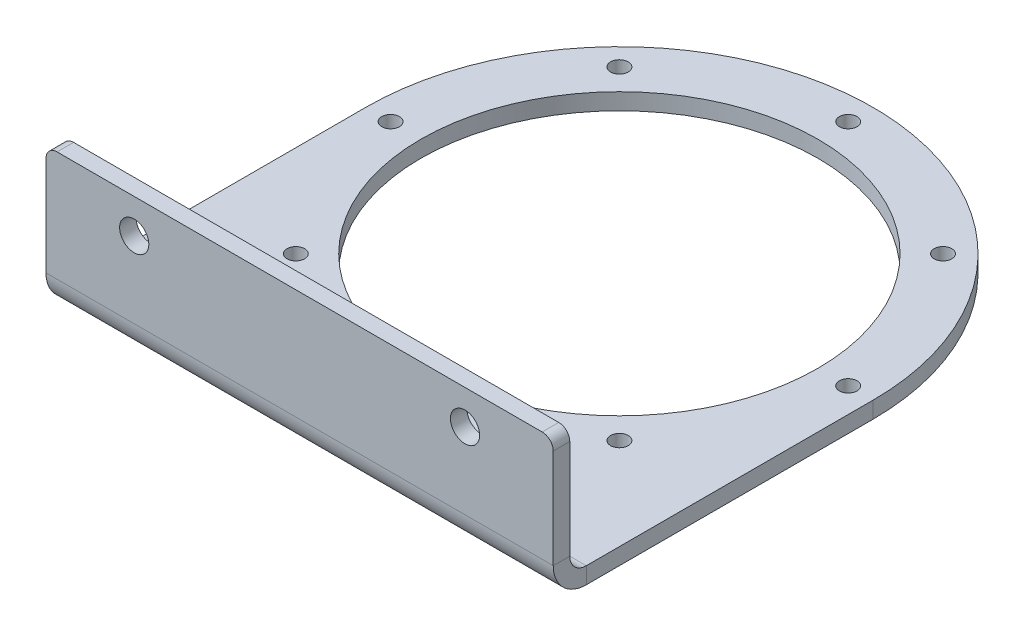
ISO-10303-21;
HEADER;
FILE_DESCRIPTION(('STEP AP214'),'2;1');
FILE_NAME('part.step','',(''),(''),'','','');
FILE_SCHEMA(('AUTOMOTIVE_DESIGN { 1 0 10303 214 1 1 1 1 }'));
ENDSEC;
DATA;
#1=APPLICATION_CONTEXT('core data for automotive mechanical design processes');
#2=APPLICATION_PROTOCOL_DEFINITION('international standard','automotive_design',2000,#1);
#3=PRODUCT_CONTEXT('',#1,'mechanical');
#4=PRODUCT('Part','Part','',(#3));
#5=PRODUCT_RELATED_PRODUCT_CATEGORY('part','',(#4));
#6=PRODUCT_DEFINITION_FORMATION('','',#4);
#7=PRODUCT_DEFINITION_CONTEXT('part definition',#1,'design');
#8=PRODUCT_DEFINITION('design','',#6,#7);
#9=PRODUCT_DEFINITION_SHAPE('','',#8);
#10=(LENGTH_UNIT() NAMED_UNIT(*) SI_UNIT(.MILLI.,.METRE.));
#11=(NAMED_UNIT(*) PLANE_ANGLE_UNIT() SI_UNIT($,.RADIAN.));
#12=(NAMED_UNIT(*) SI_UNIT($,.STERADIAN.) SOLID_ANGLE_UNIT());
#13=UNCERTAINTY_MEASURE_WITH_UNIT(LENGTH_MEASURE(1.E-05),#10,'distance_accuracy_value','');
#14=(GEOMETRIC_REPRESENTATION_CONTEXT(3) GLOBAL_UNCERTAINTY_ASSIGNED_CONTEXT((#13)) GLOBAL_UNIT_ASSIGNED_CONTEXT((#10,
#11,#12)) REPRESENTATION_CONTEXT('',''));
#15=CARTESIAN_POINT('',(0.,0.,0.));
#16=DIRECTION('',(0.,0.,1.));
#17=DIRECTION('',(1.,0.,0.));
#18=AXIS2_PLACEMENT_3D('',#15,#16,#17);
#19=CARTESIAN_POINT('',(46.,-3.,55.));
#20=DIRECTION('',(1.,0.,0.));
#21=DIRECTION('',(0.,0.,-1.));
#22=AXIS2_PLACEMENT_3D('',#19,#20,#21);
#23=PLANE('',#22);
#24=DIRECTION('',(0.,0.,-1.));
#25=VECTOR('',#24,1.);
#26=CARTESIAN_POINT('',(46.,0.,55.));
#27=LINE('',#26,#25);
#28=CARTESIAN_POINT('',(46.,0.,52.));
#29=VERTEX_POINT('',#28);
#30=CARTESIAN_POINT('',(46.,0.,0.));
#31=VERTEX_POINT('',#30);
#32=EDGE_CURVE('E220',#29,#31,#27,.T.);
#33=ORIENTED_EDGE('',*,*,#32,.F.);
#34=DIRECTION('',(0.,-1.,0.));
#35=VECTOR('',#34,1.);
#36=CARTESIAN_POINT('',(46.,0.,52.));
#37=LINE('',#36,#35);
#38=CARTESIAN_POINT('',(46.,-3.00000000000001,52.));
#39=VERTEX_POINT('',#38);
#40=EDGE_CURVE('E188',#29,#39,#37,.T.);
#41=ORIENTED_EDGE('',*,*,#40,.T.);
#42=DIRECTION('',(0.,0.,-1.));
#43=VECTOR('',#42,1.);
#44=CARTESIAN_POINT('',(46.,-3.,55.));
#45=LINE('',#44,#43);
#46=CARTESIAN_POINT('',(46.,-3.,0.));
#47=VERTEX_POINT('',#46);
#48=EDGE_CURVE('E224',#39,#47,#45,.T.);
#49=ORIENTED_EDGE('',*,*,#48,.T.);
#50=DIRECTION('',(0.,1.,0.));
#51=VECTOR('',#50,1.);
#52=CARTESIAN_POINT('',(46.,-3.,0.));
#53=LINE('',#52,#51);
#54=EDGE_CURVE('E237',#47,#31,#53,.T.);
#55=ORIENTED_EDGE('',*,*,#54,.T.);
#56=EDGE_LOOP('',(#33,#41,#49,#55));
#57=FACE_BOUND('',#56,.T.);
#58=ADVANCED_FACE('F49',(#57),#23,.T.);
#59=CARTESIAN_POINT('',(0.,-3.,0.));
#60=DIRECTION('',(0.,1.,0.));
#61=DIRECTION('',(0.,0.,1.));
#62=AXIS2_PLACEMENT_3D('',#59,#60,#61);
#63=PLANE('',#62);
#64=CARTESIAN_POINT('',(0.,-3.,-41.5));
#65=DIRECTION('',(0.,1.,0.));
#66=DIRECTION('',(0.,0.,1.));
#67=AXIS2_PLACEMENT_3D('',#64,#65,#66);
#68=CIRCLE('',#67,1.59999999999998);
#69=CARTESIAN_POINT('',(0.,-3.,-39.9));
#70=VERTEX_POINT('',#69);
#71=EDGE_CURVE('E274',#70,#70,#68,.T.);
#72=ORIENTED_EDGE('',*,*,#71,.T.);
#73=EDGE_LOOP('',(#72));
#74=FACE_BOUND('',#73,.T.);
#75=CARTESIAN_POINT('',(29.3449314192417,-3.,-29.3449314192417));
#76=DIRECTION('',(0.,1.,0.));
#77=DIRECTION('',(0.,0.,1.));
#78=AXIS2_PLACEMENT_3D('',#75,#76,#77);
#79=CIRCLE('',#78,1.59999999999997);
#80=CARTESIAN_POINT('',(29.3449314192417,-3.,-27.7449314192418));
#81=VERTEX_POINT('',#80);
#82=EDGE_CURVE('E293',#81,#81,#79,.T.);
#83=ORIENTED_EDGE('',*,*,#82,.T.);
#84=EDGE_LOOP('',(#83));
#85=FACE_BOUND('',#84,.T.);
#86=CARTESIAN_POINT('',(41.5,-3.,0.));
#87=DIRECTION('',(0.,1.,0.));
#88=DIRECTION('',(0.,0.,1.));
#89=AXIS2_PLACEMENT_3D('',#86,#87,#88);
#90=CIRCLE('',#89,1.59999999999998);
#91=CARTESIAN_POINT('',(41.5,-3.,1.59999999999997));
#92=VERTEX_POINT('',#91);
#93=EDGE_CURVE('E301',#92,#92,#90,.T.);
#94=ORIENTED_EDGE('',*,*,#93,.T.);
#95=EDGE_LOOP('',(#94));
#96=FACE_BOUND('',#95,.T.);
#97=CARTESIAN_POINT('',(29.3449314192417,-3.,29.3449314192417));
#98=DIRECTION('',(0.,1.,0.));
#99=DIRECTION('',(0.,0.,1.));
#100=AXIS2_PLACEMENT_3D('',#97,#98,#99);
#101=CIRCLE('',#100,1.59999999999997);
#102=CARTESIAN_POINT('',(29.3449314192417,-3.,30.9449314192417));
#103=VERTEX_POINT('',#102);
#104=EDGE_CURVE('E309',#103,#103,#101,.T.);
#105=ORIENTED_EDGE('',*,*,#104,.T.);
#106=EDGE_LOOP('',(#105));
#107=FACE_BOUND('',#106,.T.);
#108=CARTESIAN_POINT('',(0.,-3.,41.5));
#109=DIRECTION('',(0.,1.,0.));
#110=DIRECTION('',(0.,0.,1.));
#111=AXIS2_PLACEMENT_3D('',#108,#109,#110);
#112=CIRCLE('',#111,1.59999999999998);
#113=CARTESIAN_POINT('',(0.,-3.,43.1));
#114=VERTEX_POINT('',#113);
#115=EDGE_CURVE('E317',#114,#114,#112,.T.);
#116=ORIENTED_EDGE('',*,*,#115,.T.);
#117=EDGE_LOOP('',(#116));
#118=FACE_BOUND('',#117,.T.);
#119=CARTESIAN_POINT('',(-29.3449314192417,-3.,29.3449314192417));
#120=DIRECTION('',(0.,1.,0.));
#121=DIRECTION('',(0.,0.,1.));
#122=AXIS2_PLACEMENT_3D('',#119,#120,#121);
#123=CIRCLE('',#122,1.59999999999997);
#124=CARTESIAN_POINT('',(-29.3449314192417,-3.,30.9449314192417));
#125=VERTEX_POINT('',#124);
#126=EDGE_CURVE('E325',#125,#125,#123,.T.);
#127=ORIENTED_EDGE('',*,*,#126,.T.);
#128=EDGE_LOOP('',(#127));
#129=FACE_BOUND('',#128,.T.);
#130=CARTESIAN_POINT('',(-41.5,-3.,0.));
#131=DIRECTION('',(0.,1.,0.));
#132=DIRECTION('',(0.,0.,1.));
#133=AXIS2_PLACEMENT_3D('',#130,#131,#132);
#134=CIRCLE('',#133,1.59999999999998);
#135=CARTESIAN_POINT('',(-41.5,-3.,1.59999999999998));
#136=VERTEX_POINT('',#135);
#137=EDGE_CURVE('E333',#136,#136,#134,.T.);
#138=ORIENTED_EDGE('',*,*,#137,.T.);
#139=EDGE_LOOP('',(#138));
#140=FACE_BOUND('',#139,.T.);
#141=CARTESIAN_POINT('',(-29.3449314192417,-3.,-29.3449314192417));
#142=DIRECTION('',(0.,1.,0.));
#143=DIRECTION('',(0.,0.,1.));
#144=AXIS2_PLACEMENT_3D('',#141,#142,#143);
#145=CIRCLE('',#144,1.59999999999997);
#146=CARTESIAN_POINT('',(-29.3449314192417,-3.,-27.7449314192418));
#147=VERTEX_POINT('',#146);
#148=EDGE_CURVE('E341',#147,#147,#145,.T.);
#149=ORIENTED_EDGE('',*,*,#148,.T.);
#150=EDGE_LOOP('',(#149));
#151=FACE_BOUND('',#150,.T.);
#152=CARTESIAN_POINT('',(0.,-3.,0.));
#153=DIRECTION('',(0.,1.,0.));
#154=DIRECTION('',(0.,0.,1.));
#155=AXIS2_PLACEMENT_3D('',#152,#153,#154);
#156=CIRCLE('',#155,36.);
#157=CARTESIAN_POINT('',(0.,-3.,36.));
#158=VERTEX_POINT('',#157);
#159=EDGE_CURVE('E207',#158,#158,#156,.T.);
#160=ORIENTED_EDGE('',*,*,#159,.T.);
#161=EDGE_LOOP('',(#160));
#162=FACE_BOUND('',#161,.T.);
#163=DIRECTION('',(1.,0.,0.));
#164=VECTOR('',#163,1.);
#165=CARTESIAN_POINT('',(46.,-3.00000000000001,52.));
#166=LINE('',#165,#164);
#167=CARTESIAN_POINT('',(-46.,-3.,52.));
#168=VERTEX_POINT('',#167);
#169=EDGE_CURVE('E139',#39,#168,#166,.F.);
#170=ORIENTED_EDGE('',*,*,#169,.T.);
#171=DIRECTION('',(0.,0.,1.));
#172=VECTOR('',#171,1.);
#173=CARTESIAN_POINT('',(-46.,-3.,0.));
#174=LINE('',#173,#172);
#175=CARTESIAN_POINT('',(-46.,-3.,0.));
#176=VERTEX_POINT('',#175);
#177=EDGE_CURVE('E219',#176,#168,#174,.T.);
#178=ORIENTED_EDGE('',*,*,#177,.F.);
#179=CARTESIAN_POINT('',(0.,-3.,0.));
#180=DIRECTION('',(0.,1.,0.));
#181=DIRECTION('',(0.,0.,1.));
#182=AXIS2_PLACEMENT_3D('',#179,#180,#181);
#183=CIRCLE('',#182,46.);
#184=EDGE_CURVE('E215',#47,#176,#183,.T.);
#185=ORIENTED_EDGE('',*,*,#184,.F.);
#186=ORIENTED_EDGE('',*,*,#48,.F.);
#187=EDGE_LOOP('',(#170,#178,#185,#186));
#188=FACE_BOUND('',#187,.T.);
#189=ADVANCED_FACE('F379',(#74,#85,#96,#107,#118,#129,#140,#151,#162,#188),#63,.F.);
#190=CARTESIAN_POINT('',(0.,0.,0.));
#191=DIRECTION('',(0.,1.,0.));
#192=DIRECTION('',(0.,0.,1.));
#193=AXIS2_PLACEMENT_3D('',#190,#191,#192);
#194=PLANE('',#193);
#195=CARTESIAN_POINT('',(0.,0.,-41.5));
#196=DIRECTION('',(0.,1.,0.));
#197=DIRECTION('',(0.,0.,1.));
#198=AXIS2_PLACEMENT_3D('',#195,#196,#197);
#199=CIRCLE('',#198,1.59999999999998);
#200=CARTESIAN_POINT('',(0.,0.,-39.9));
#201=VERTEX_POINT('',#200);
#202=EDGE_CURVE('E266',#201,#201,#199,.T.);
#203=ORIENTED_EDGE('',*,*,#202,.F.);
#204=EDGE_LOOP('',(#203));
#205=FACE_BOUND('',#204,.T.);
#206=CARTESIAN_POINT('',(29.3449314192417,0.,-29.3449314192417));
#207=DIRECTION('',(0.,1.,0.));
#208=DIRECTION('',(0.,0.,1.));
#209=AXIS2_PLACEMENT_3D('',#206,#207,#208);
#210=CIRCLE('',#209,1.59999999999998);
#211=CARTESIAN_POINT('',(29.3449314192417,0.,-27.7449314192417));
#212=VERTEX_POINT('',#211);
#213=EDGE_CURVE('E289',#212,#212,#210,.T.);
#214=ORIENTED_EDGE('',*,*,#213,.F.);
#215=EDGE_LOOP('',(#214));
#216=FACE_BOUND('',#215,.T.);
#217=CARTESIAN_POINT('',(41.5,0.,0.));
#218=DIRECTION('',(0.,1.,0.));
#219=DIRECTION('',(0.,0.,1.));
#220=AXIS2_PLACEMENT_3D('',#217,#218,#219);
#221=CIRCLE('',#220,1.59999999999998);
#222=CARTESIAN_POINT('',(41.5,0.,1.59999999999998));
#223=VERTEX_POINT('',#222);
#224=EDGE_CURVE('E297',#223,#223,#221,.T.);
#225=ORIENTED_EDGE('',*,*,#224,.F.);
#226=EDGE_LOOP('',(#225));
#227=FACE_BOUND('',#226,.T.);
#228=CARTESIAN_POINT('',(29.3449314192417,0.,29.3449314192417));
#229=DIRECTION('',(0.,1.,0.));
#230=DIRECTION('',(0.,0.,1.));
#231=AXIS2_PLACEMENT_3D('',#228,#229,#230);
#232=CIRCLE('',#231,1.59999999999998);
#233=CARTESIAN_POINT('',(29.3449314192417,0.,30.9449314192417));
#234=VERTEX_POINT('',#233);
#235=EDGE_CURVE('E305',#234,#234,#232,.T.);
#236=ORIENTED_EDGE('',*,*,#235,.F.);
#237=EDGE_LOOP('',(#236));
#238=FACE_BOUND('',#237,.T.);
#239=CARTESIAN_POINT('',(0.,0.,41.5));
#240=DIRECTION('',(0.,1.,0.));
#241=DIRECTION('',(0.,0.,1.));
#242=AXIS2_PLACEMENT_3D('',#239,#240,#241);
#243=CIRCLE('',#242,1.59999999999998);
#244=CARTESIAN_POINT('',(0.,0.,43.1));
#245=VERTEX_POINT('',#244);
#246=EDGE_CURVE('E313',#245,#245,#243,.T.);
#247=ORIENTED_EDGE('',*,*,#246,.F.);
#248=EDGE_LOOP('',(#247));
#249=FACE_BOUND('',#248,.T.);
#250=CARTESIAN_POINT('',(-29.3449314192417,0.,29.3449314192417));
#251=DIRECTION('',(0.,1.,0.));
#252=DIRECTION('',(0.,0.,1.));
#253=AXIS2_PLACEMENT_3D('',#250,#251,#252);
#254=CIRCLE('',#253,1.59999999999998);
#255=CARTESIAN_POINT('',(-29.3449314192417,0.,30.9449314192417));
#256=VERTEX_POINT('',#255);
#257=EDGE_CURVE('E321',#256,#256,#254,.T.);
#258=ORIENTED_EDGE('',*,*,#257,.F.);
#259=EDGE_LOOP('',(#258));
#260=FACE_BOUND('',#259,.T.);
#261=CARTESIAN_POINT('',(-41.5,0.,0.));
#262=DIRECTION('',(0.,1.,0.));
#263=DIRECTION('',(0.,0.,1.));
#264=AXIS2_PLACEMENT_3D('',#261,#262,#263);
#265=CIRCLE('',#264,1.59999999999998);
#266=CARTESIAN_POINT('',(-41.5,0.,1.59999999999999));
#267=VERTEX_POINT('',#266);
#268=EDGE_CURVE('E329',#267,#267,#265,.T.);
#269=ORIENTED_EDGE('',*,*,#268,.F.);
#270=EDGE_LOOP('',(#269));
#271=FACE_BOUND('',#270,.T.);
#272=CARTESIAN_POINT('',(-29.3449314192417,0.,-29.3449314192417));
#273=DIRECTION('',(0.,1.,0.));
#274=DIRECTION('',(0.,0.,1.));
#275=AXIS2_PLACEMENT_3D('',#272,#273,#274);
#276=CIRCLE('',#275,1.59999999999998);
#277=CARTESIAN_POINT('',(-29.3449314192417,0.,-27.7449314192417));
#278=VERTEX_POINT('',#277);
#279=EDGE_CURVE('E337',#278,#278,#276,.T.);
#280=ORIENTED_EDGE('',*,*,#279,.F.);
#281=EDGE_LOOP('',(#280));
#282=FACE_BOUND('',#281,.T.);
#283=CARTESIAN_POINT('',(0.,0.,0.));
#284=DIRECTION('',(0.,1.,0.));
#285=DIRECTION('',(0.,0.,1.));
#286=AXIS2_PLACEMENT_3D('',#283,#284,#285);
#287=CIRCLE('',#286,36.);
#288=CARTESIAN_POINT('',(0.,0.,36.));
#289=VERTEX_POINT('',#288);
#290=EDGE_CURVE('E203',#289,#289,#287,.T.);
#291=ORIENTED_EDGE('',*,*,#290,.F.);
#292=EDGE_LOOP('',(#291));
#293=FACE_BOUND('',#292,.T.);
#294=DIRECTION('',(0.,0.,1.));
#295=VECTOR('',#294,1.);
#296=CARTESIAN_POINT('',(-46.,0.,0.));
#297=LINE('',#296,#295);
#298=CARTESIAN_POINT('',(-46.,0.,0.));
#299=VERTEX_POINT('',#298);
#300=CARTESIAN_POINT('',(-46.,0.,52.));
#301=VERTEX_POINT('',#300);
#302=EDGE_CURVE('E231',#299,#301,#297,.T.);
#303=ORIENTED_EDGE('',*,*,#302,.T.);
#304=DIRECTION('',(1.,0.,0.));
#305=VECTOR('',#304,1.);
#306=CARTESIAN_POINT('',(46.,0.,52.));
#307=LINE('',#306,#305);
#308=EDGE_CURVE('E193',#29,#301,#307,.F.);
#309=ORIENTED_EDGE('',*,*,#308,.F.);
#310=ORIENTED_EDGE('',*,*,#32,.T.);
#311=CARTESIAN_POINT('',(0.,0.,0.));
#312=DIRECTION('',(0.,1.,0.));
#313=DIRECTION('',(0.,0.,1.));
#314=AXIS2_PLACEMENT_3D('',#311,#312,#313);
#315=CIRCLE('',#314,46.);
#316=EDGE_CURVE('E211',#31,#299,#315,.T.);
#317=ORIENTED_EDGE('',*,*,#316,.T.);
#318=EDGE_LOOP('',(#303,#309,#310,#317));
#319=FACE_BOUND('',#318,.T.);
#320=ADVANCED_FACE('F387',(#205,#216,#227,#238,#249,#260,#271,#282,#293,#319),#194,.T.);
#321=CARTESIAN_POINT('',(0.,-3.,0.));
#322=DIRECTION('',(0.,1.,0.));
#323=DIRECTION('',(0.,0.,1.));
#324=AXIS2_PLACEMENT_3D('',#321,#322,#323);
#325=CYLINDRICAL_SURFACE('',#324,46.);
#326=ORIENTED_EDGE('',*,*,#316,.F.);
#327=ORIENTED_EDGE('',*,*,#54,.F.);
#328=ORIENTED_EDGE('',*,*,#184,.T.);
#329=DIRECTION('',(0.,1.,0.));
#330=VECTOR('',#329,1.);
#331=CARTESIAN_POINT('',(-46.,-3.,0.));
#332=LINE('',#331,#330);
#333=EDGE_CURVE('E227',#176,#299,#332,.T.);
#334=ORIENTED_EDGE('',*,*,#333,.T.);
#335=EDGE_LOOP('',(#326,#327,#328,#334));
#336=FACE_BOUND('',#335,.T.);
#337=ADVANCED_FACE('F395',(#336),#325,.T.);
#338=CARTESIAN_POINT('',(-46.,-3.,0.));
#339=DIRECTION('',(-1.,0.,0.));
#340=DIRECTION('',(0.,0.,1.));
#341=AXIS2_PLACEMENT_3D('',#338,#339,#340);
#342=PLANE('',#341);
#343=DIRECTION('',(0.,-1.,0.));
#344=VECTOR('',#343,1.);
#345=CARTESIAN_POINT('',(-46.,0.,52.));
#346=LINE('',#345,#344);
#347=EDGE_CURVE('E199',#301,#168,#346,.T.);
#348=ORIENTED_EDGE('',*,*,#347,.F.);
#349=ORIENTED_EDGE('',*,*,#302,.F.);
#350=ORIENTED_EDGE('',*,*,#333,.F.);
#351=ORIENTED_EDGE('',*,*,#177,.T.);
#352=EDGE_LOOP('',(#348,#349,#350,#351));
#353=FACE_BOUND('',#352,.T.);
#354=ADVANCED_FACE('F393',(#353),#342,.T.);
#355=CARTESIAN_POINT('',(0.,-3.,0.));
#356=DIRECTION('',(0.,1.,0.));
#357=DIRECTION('',(0.,0.,1.));
#358=AXIS2_PLACEMENT_3D('',#355,#356,#357);
#359=CYLINDRICAL_SURFACE('',#358,36.);
#360=ORIENTED_EDGE('',*,*,#159,.F.);
#361=EDGE_LOOP('',(#360));
#362=FACE_BOUND('',#361,.T.);
#363=ORIENTED_EDGE('',*,*,#290,.T.);
#364=EDGE_LOOP('',(#363));
#365=FACE_BOUND('',#364,.T.);
#366=ADVANCED_FACE('F394',(#362,#365),#359,.F.);
#367=CARTESIAN_POINT('',(-46.,2.99999999999999,52.));
#368=DIRECTION('',(-1.,0.,0.));
#369=DIRECTION('',(0.,0.,1.));
#370=AXIS2_PLACEMENT_3D('',#367,#368,#369);
#371=PLANE('',#370);
#372=DIRECTION('',(0.,0.,1.));
#373=VECTOR('',#372,1.);
#374=CARTESIAN_POINT('',(-46.,2.99999999999999,55.));
#375=LINE('',#374,#373);
#376=CARTESIAN_POINT('',(-46.,2.99999999999999,55.));
#377=VERTEX_POINT('',#376);
#378=CARTESIAN_POINT('',(-46.,2.99999999999999,58.));
#379=VERTEX_POINT('',#378);
#380=EDGE_CURVE('E174',#377,#379,#375,.T.);
#381=ORIENTED_EDGE('',*,*,#380,.F.);
#382=CARTESIAN_POINT('',(-46.,2.99999999999999,52.));
#383=DIRECTION('',(1.,0.,0.));
#384=DIRECTION('',(0.,0.,-1.));
#385=AXIS2_PLACEMENT_3D('',#382,#383,#384);
#386=CIRCLE('',#385,3.);
#387=EDGE_CURVE('E143',#301,#377,#386,.F.);
#388=ORIENTED_EDGE('',*,*,#387,.F.);
#389=ORIENTED_EDGE('',*,*,#347,.T.);
#390=CARTESIAN_POINT('',(-46.,2.99999999999999,52.));
#391=DIRECTION('',(1.,0.,0.));
#392=DIRECTION('',(0.,0.,-1.));
#393=AXIS2_PLACEMENT_3D('',#390,#391,#392);
#394=CIRCLE('',#393,6.);
#395=EDGE_CURVE('E186',#168,#379,#394,.F.);
#396=ORIENTED_EDGE('',*,*,#395,.T.);
#397=EDGE_LOOP('',(#381,#388,#389,#396));
#398=FACE_BOUND('',#397,.T.);
#399=ADVANCED_FACE('F359',(#398),#371,.T.);
#400=CARTESIAN_POINT('',(46.,2.99999999999999,52.));
#401=DIRECTION('',(-1.,0.,0.));
#402=DIRECTION('',(0.,0.,1.));
#403=AXIS2_PLACEMENT_3D('',#400,#401,#402);
#404=PLANE('',#403);
#405=CARTESIAN_POINT('',(46.,2.99999999999999,52.));
#406=DIRECTION('',(1.,0.,0.));
#407=DIRECTION('',(0.,0.,-1.));
#408=AXIS2_PLACEMENT_3D('',#405,#406,#407);
#409=CIRCLE('',#408,3.);
#410=CARTESIAN_POINT('',(46.,2.99999999999999,55.));
#411=VERTEX_POINT('',#410);
#412=EDGE_CURVE('E150',#411,#29,#409,.T.);
#413=ORIENTED_EDGE('',*,*,#412,.F.);
#414=DIRECTION('',(0.,0.,1.));
#415=VECTOR('',#414,1.);
#416=CARTESIAN_POINT('',(46.,2.99999999999999,55.));
#417=LINE('',#416,#415);
#418=CARTESIAN_POINT('',(46.,2.99999999999999,58.));
#419=VERTEX_POINT('',#418);
#420=EDGE_CURVE('E147',#411,#419,#417,.T.);
#421=ORIENTED_EDGE('',*,*,#420,.T.);
#422=CARTESIAN_POINT('',(46.,2.99999999999999,52.));
#423=DIRECTION('',(1.,0.,0.));
#424=DIRECTION('',(0.,0.,-1.));
#425=AXIS2_PLACEMENT_3D('',#422,#423,#424);
#426=CIRCLE('',#425,6.);
#427=EDGE_CURVE('E132',#419,#39,#426,.T.);
#428=ORIENTED_EDGE('',*,*,#427,.T.);
#429=ORIENTED_EDGE('',*,*,#40,.F.);
#430=EDGE_LOOP('',(#413,#421,#428,#429));
#431=FACE_BOUND('',#430,.T.);
#432=ADVANCED_FACE('F148',(#431),#404,.F.);
#433=CARTESIAN_POINT('',(46.,2.99999999999999,52.));
#434=DIRECTION('',(1.,0.,0.));
#435=DIRECTION('',(0.,0.,1.));
#436=AXIS2_PLACEMENT_3D('',#433,#434,#435);
#437=CYLINDRICAL_SURFACE('',#436,6.);
#438=ORIENTED_EDGE('',*,*,#169,.F.);
#439=ORIENTED_EDGE('',*,*,#427,.F.);
#440=DIRECTION('',(-1.,0.,0.));
#441=VECTOR('',#440,1.);
#442=CARTESIAN_POINT('',(0.,2.99999999999999,58.));
#443=LINE('',#442,#441);
#444=EDGE_CURVE('E137',#419,#379,#443,.T.);
#445=ORIENTED_EDGE('',*,*,#444,.T.);
#446=ORIENTED_EDGE('',*,*,#395,.F.);
#447=EDGE_LOOP('',(#438,#439,#445,#446));
#448=FACE_BOUND('',#447,.T.);
#449=ADVANCED_FACE('F134',(#448),#437,.T.);
#450=CARTESIAN_POINT('',(46.,2.99999999999999,52.));
#451=DIRECTION('',(1.,0.,0.));
#452=DIRECTION('',(0.,0.,1.));
#453=AXIS2_PLACEMENT_3D('',#450,#451,#452);
#454=CYLINDRICAL_SURFACE('',#453,3.);
#455=ORIENTED_EDGE('',*,*,#308,.T.);
#456=ORIENTED_EDGE('',*,*,#387,.T.);
#457=DIRECTION('',(1.,0.,0.));
#458=VECTOR('',#457,1.);
#459=CARTESIAN_POINT('',(-46.,2.99999999999999,55.));
#460=LINE('',#459,#458);
#461=EDGE_CURVE('E153',#377,#411,#460,.T.);
#462=ORIENTED_EDGE('',*,*,#461,.T.);
#463=ORIENTED_EDGE('',*,*,#412,.T.);
#464=EDGE_LOOP('',(#455,#456,#462,#463));
#465=FACE_BOUND('',#464,.T.);
#466=ADVANCED_FACE('F360',(#465),#454,.F.);
#467=CARTESIAN_POINT('',(0.,0.,58.));
#468=DIRECTION('',(0.,0.,-1.));
#469=DIRECTION('',(-1.,0.,0.));
#470=AXIS2_PLACEMENT_3D('',#467,#468,#469);
#471=PLANE('',#470);
#472=CARTESIAN_POINT('',(30.,16.8,58.));
#473=DIRECTION('',(0.,0.,1.));
#474=DIRECTION('',(1.,0.,0.));
#475=AXIS2_PLACEMENT_3D('',#472,#473,#474);
#476=CIRCLE('',#475,2.64999999999999);
#477=CARTESIAN_POINT('',(32.65,16.8,58.));
#478=VERTEX_POINT('',#477);
#479=EDGE_CURVE('E283',#478,#478,#476,.T.);
#480=ORIENTED_EDGE('',*,*,#479,.F.);
#481=EDGE_LOOP('',(#480));
#482=FACE_BOUND('',#481,.T.);
#483=CARTESIAN_POINT('',(-30.,16.8,58.));
#484=DIRECTION('',(0.,0.,1.));
#485=DIRECTION('',(1.,0.,0.));
#486=AXIS2_PLACEMENT_3D('',#483,#484,#485);
#487=CIRCLE('',#486,2.64999999999999);
#488=CARTESIAN_POINT('',(-27.35,16.8,58.));
#489=VERTEX_POINT('',#488);
#490=EDGE_CURVE('E267',#489,#489,#487,.T.);
#491=ORIENTED_EDGE('',*,*,#490,.F.);
#492=EDGE_LOOP('',(#491));
#493=FACE_BOUND('',#492,.T.);
#494=DIRECTION('',(-1.,0.,0.));
#495=VECTOR('',#494,1.);
#496=CARTESIAN_POINT('',(-46.,23.,58.));
#497=LINE('',#496,#495);
#498=CARTESIAN_POINT('',(44.,23.,58.));
#499=VERTEX_POINT('',#498);
#500=CARTESIAN_POINT('',(-44.,23.,58.));
#501=VERTEX_POINT('',#500);
#502=EDGE_CURVE('E160',#499,#501,#497,.T.);
#503=ORIENTED_EDGE('',*,*,#502,.T.);
#504=CARTESIAN_POINT('',(-44.,21.,58.));
#505=DIRECTION('',(0.,0.,-1.));
#506=DIRECTION('',(-1.,0.,0.));
#507=AXIS2_PLACEMENT_3D('',#504,#505,#506);
#508=CIRCLE('',#507,2.);
#509=CARTESIAN_POINT('',(-46.,21.,58.));
#510=VERTEX_POINT('',#509);
#511=EDGE_CURVE('E59',#501,#510,#508,.F.);
#512=ORIENTED_EDGE('',*,*,#511,.T.);
#513=DIRECTION('',(0.,-1.,0.));
#514=VECTOR('',#513,1.);
#515=CARTESIAN_POINT('',(-46.,0.,58.));
#516=LINE('',#515,#514);
#517=EDGE_CURVE('E161',#510,#379,#516,.T.);
#518=ORIENTED_EDGE('',*,*,#517,.T.);
#519=ORIENTED_EDGE('',*,*,#444,.F.);
#520=DIRECTION('',(0.,1.,0.));
#521=VECTOR('',#520,1.);
#522=CARTESIAN_POINT('',(46.,23.,58.));
#523=LINE('',#522,#521);
#524=CARTESIAN_POINT('',(46.,21.,58.));
#525=VERTEX_POINT('',#524);
#526=EDGE_CURVE('E155',#419,#525,#523,.T.);
#527=ORIENTED_EDGE('',*,*,#526,.T.);
#528=CARTESIAN_POINT('',(44.,21.,58.));
#529=DIRECTION('',(0.,0.,-1.));
#530=DIRECTION('',(-1.,0.,0.));
#531=AXIS2_PLACEMENT_3D('',#528,#529,#530);
#532=CIRCLE('',#531,2.);
#533=EDGE_CURVE('E259',#525,#499,#532,.F.);
#534=ORIENTED_EDGE('',*,*,#533,.T.);
#535=EDGE_LOOP('',(#503,#512,#518,#519,#527,#534));
#536=FACE_BOUND('',#535,.T.);
#537=ADVANCED_FACE('F163',(#482,#493,#536),#471,.F.);
#538=CARTESIAN_POINT('',(0.,0.,55.));
#539=DIRECTION('',(0.,0.,-1.));
#540=DIRECTION('',(-1.,0.,0.));
#541=AXIS2_PLACEMENT_3D('',#538,#539,#540);
#542=PLANE('',#541);
#543=CARTESIAN_POINT('',(30.,16.8,55.));
#544=DIRECTION('',(0.,0.,-1.));
#545=DIRECTION('',(-1.,0.,0.));
#546=AXIS2_PLACEMENT_3D('',#543,#544,#545);
#547=CIRCLE('',#546,2.64999999999998);
#548=CARTESIAN_POINT('',(27.35,16.8,55.));
#549=VERTEX_POINT('',#548);
#550=EDGE_CURVE('E53',#549,#549,#547,.T.);
#551=ORIENTED_EDGE('',*,*,#550,.F.);
#552=EDGE_LOOP('',(#551));
#553=FACE_BOUND('',#552,.T.);
#554=CARTESIAN_POINT('',(-30.,16.8,55.));
#555=DIRECTION('',(0.,0.,-1.));
#556=DIRECTION('',(-1.,0.,0.));
#557=AXIS2_PLACEMENT_3D('',#554,#555,#556);
#558=CIRCLE('',#557,2.64999999999998);
#559=CARTESIAN_POINT('',(-32.65,16.8,55.));
#560=VERTEX_POINT('',#559);
#561=EDGE_CURVE('E263',#560,#560,#558,.T.);
#562=ORIENTED_EDGE('',*,*,#561,.F.);
#563=EDGE_LOOP('',(#562));
#564=FACE_BOUND('',#563,.T.);
#565=DIRECTION('',(0.,-1.,0.));
#566=VECTOR('',#565,1.);
#567=CARTESIAN_POINT('',(-46.,0.,55.));
#568=LINE('',#567,#566);
#569=CARTESIAN_POINT('',(-46.,21.,55.));
#570=VERTEX_POINT('',#569);
#571=EDGE_CURVE('E166',#570,#377,#568,.T.);
#572=ORIENTED_EDGE('',*,*,#571,.F.);
#573=CARTESIAN_POINT('',(-44.,21.,55.));
#574=DIRECTION('',(0.,0.,-1.));
#575=DIRECTION('',(-1.,0.,0.));
#576=AXIS2_PLACEMENT_3D('',#573,#574,#575);
#577=CIRCLE('',#576,2.);
#578=CARTESIAN_POINT('',(-44.,23.,55.));
#579=VERTEX_POINT('',#578);
#580=EDGE_CURVE('E250',#570,#579,#577,.T.);
#581=ORIENTED_EDGE('',*,*,#580,.T.);
#582=DIRECTION('',(-1.,0.,0.));
#583=VECTOR('',#582,1.);
#584=CARTESIAN_POINT('',(-46.,23.,55.));
#585=LINE('',#584,#583);
#586=CARTESIAN_POINT('',(44.,23.,55.));
#587=VERTEX_POINT('',#586);
#588=EDGE_CURVE('E176',#587,#579,#585,.T.);
#589=ORIENTED_EDGE('',*,*,#588,.F.);
#590=CARTESIAN_POINT('',(44.,21.,55.));
#591=DIRECTION('',(0.,0.,-1.));
#592=DIRECTION('',(-1.,0.,0.));
#593=AXIS2_PLACEMENT_3D('',#590,#591,#592);
#594=CIRCLE('',#593,2.);
#595=CARTESIAN_POINT('',(46.,21.,55.));
#596=VERTEX_POINT('',#595);
#597=EDGE_CURVE('E247',#587,#596,#594,.T.);
#598=ORIENTED_EDGE('',*,*,#597,.T.);
#599=DIRECTION('',(0.,1.,0.));
#600=VECTOR('',#599,1.);
#601=CARTESIAN_POINT('',(46.,23.,55.));
#602=LINE('',#601,#600);
#603=EDGE_CURVE('E170',#411,#596,#602,.T.);
#604=ORIENTED_EDGE('',*,*,#603,.F.);
#605=ORIENTED_EDGE('',*,*,#461,.F.);
#606=EDGE_LOOP('',(#572,#581,#589,#598,#604,#605));
#607=FACE_BOUND('',#606,.T.);
#608=ADVANCED_FACE('F362',(#553,#564,#607),#542,.T.);
#609=CARTESIAN_POINT('',(-46.,0.,58.));
#610=DIRECTION('',(1.,0.,0.));
#611=DIRECTION('',(0.,0.,-1.));
#612=AXIS2_PLACEMENT_3D('',#609,#610,#611);
#613=PLANE('',#612);
#614=ORIENTED_EDGE('',*,*,#517,.F.);
#615=DIRECTION('',(0.,0.,-1.));
#616=VECTOR('',#615,1.);
#617=CARTESIAN_POINT('',(-46.,21.,58.));
#618=LINE('',#617,#616);
#619=EDGE_CURVE('E241',#510,#570,#618,.T.);
#620=ORIENTED_EDGE('',*,*,#619,.T.);
#621=ORIENTED_EDGE('',*,*,#571,.T.);
#622=ORIENTED_EDGE('',*,*,#380,.T.);
#623=EDGE_LOOP('',(#614,#620,#621,#622));
#624=FACE_BOUND('',#623,.T.);
#625=ADVANCED_FACE('F354',(#624),#613,.F.);
#626=CARTESIAN_POINT('',(46.,23.,58.));
#627=DIRECTION('',(-1.,0.,0.));
#628=DIRECTION('',(0.,0.,1.));
#629=AXIS2_PLACEMENT_3D('',#626,#627,#628);
#630=PLANE('',#629);
#631=ORIENTED_EDGE('',*,*,#603,.T.);
#632=DIRECTION('',(0.,0.,-1.));
#633=VECTOR('',#632,1.);
#634=CARTESIAN_POINT('',(46.,21.,58.));
#635=LINE('',#634,#633);
#636=EDGE_CURVE('E11',#596,#525,#635,.F.);
#637=ORIENTED_EDGE('',*,*,#636,.T.);
#638=ORIENTED_EDGE('',*,*,#526,.F.);
#639=ORIENTED_EDGE('',*,*,#420,.F.);
#640=EDGE_LOOP('',(#631,#637,#638,#639));
#641=FACE_BOUND('',#640,.T.);
#642=ADVANCED_FACE('F156',(#641),#630,.F.);
#643=CARTESIAN_POINT('',(-46.,23.,58.));
#644=DIRECTION('',(0.,-1.,0.));
#645=DIRECTION('',(0.,0.,-1.));
#646=AXIS2_PLACEMENT_3D('',#643,#644,#645);
#647=PLANE('',#646);
#648=ORIENTED_EDGE('',*,*,#588,.T.);
#649=DIRECTION('',(0.,0.,-1.));
#650=VECTOR('',#649,1.);
#651=CARTESIAN_POINT('',(-44.,23.,58.));
#652=LINE('',#651,#650);
#653=EDGE_CURVE('E73',#579,#501,#652,.F.);
#654=ORIENTED_EDGE('',*,*,#653,.T.);
#655=ORIENTED_EDGE('',*,*,#502,.F.);
#656=DIRECTION('',(0.,0.,-1.));
#657=VECTOR('',#656,1.);
#658=CARTESIAN_POINT('',(44.,23.,58.));
#659=LINE('',#658,#657);
#660=EDGE_CURVE('E253',#499,#587,#659,.T.);
#661=ORIENTED_EDGE('',*,*,#660,.T.);
#662=EDGE_LOOP('',(#648,#654,#655,#661));
#663=FACE_BOUND('',#662,.T.);
#664=ADVANCED_FACE('F367',(#663),#647,.F.);
#665=CARTESIAN_POINT('',(-44.,21.,58.));
#666=DIRECTION('',(0.,0.,-1.));
#667=DIRECTION('',(-1.,0.,0.));
#668=AXIS2_PLACEMENT_3D('',#665,#666,#667);
#669=CYLINDRICAL_SURFACE('',#668,2.);
#670=ORIENTED_EDGE('',*,*,#511,.F.);
#671=ORIENTED_EDGE('',*,*,#653,.F.);
#672=ORIENTED_EDGE('',*,*,#580,.F.);
#673=ORIENTED_EDGE('',*,*,#619,.F.);
#674=EDGE_LOOP('',(#670,#671,#672,#673));
#675=FACE_BOUND('',#674,.T.);
#676=ADVANCED_FACE('F369',(#675),#669,.T.);
#677=CARTESIAN_POINT('',(44.,21.,58.));
#678=DIRECTION('',(0.,0.,-1.));
#679=DIRECTION('',(-1.,0.,0.));
#680=AXIS2_PLACEMENT_3D('',#677,#678,#679);
#681=CYLINDRICAL_SURFACE('',#680,2.);
#682=ORIENTED_EDGE('',*,*,#533,.F.);
#683=ORIENTED_EDGE('',*,*,#636,.F.);
#684=ORIENTED_EDGE('',*,*,#597,.F.);
#685=ORIENTED_EDGE('',*,*,#660,.F.);
#686=EDGE_LOOP('',(#682,#683,#684,#685));
#687=FACE_BOUND('',#686,.T.);
#688=ADVANCED_FACE('F51',(#687),#681,.T.);
#689=CARTESIAN_POINT('',(-29.3449314192417,0.,-29.3449314192417));
#690=DIRECTION('',(0.,1.,0.));
#691=DIRECTION('',(0.,0.,1.));
#692=AXIS2_PLACEMENT_3D('',#689,#690,#691);
#693=CYLINDRICAL_SURFACE('',#692,1.59999999999997);
#694=ORIENTED_EDGE('',*,*,#279,.T.);
#695=EDGE_LOOP('',(#694));
#696=FACE_BOUND('',#695,.T.);
#697=ORIENTED_EDGE('',*,*,#148,.F.);
#698=EDGE_LOOP('',(#697));
#699=FACE_BOUND('',#698,.T.);
#700=ADVANCED_FACE('F375',(#696,#699),#693,.F.);
#701=CARTESIAN_POINT('',(-41.5,0.,0.));
#702=DIRECTION('',(0.,1.,0.));
#703=DIRECTION('',(0.,0.,1.));
#704=AXIS2_PLACEMENT_3D('',#701,#702,#703);
#705=CYLINDRICAL_SURFACE('',#704,1.59999999999998);
#706=ORIENTED_EDGE('',*,*,#268,.T.);
#707=EDGE_LOOP('',(#706));
#708=FACE_BOUND('',#707,.T.);
#709=ORIENTED_EDGE('',*,*,#137,.F.);
#710=EDGE_LOOP('',(#709));
#711=FACE_BOUND('',#710,.T.);
#712=ADVANCED_FACE('F456',(#708,#711),#705,.F.);
#713=CARTESIAN_POINT('',(-29.3449314192417,0.,29.3449314192417));
#714=DIRECTION('',(0.,1.,0.));
#715=DIRECTION('',(0.,0.,1.));
#716=AXIS2_PLACEMENT_3D('',#713,#714,#715);
#717=CYLINDRICAL_SURFACE('',#716,1.59999999999997);
#718=ORIENTED_EDGE('',*,*,#257,.T.);
#719=EDGE_LOOP('',(#718));
#720=FACE_BOUND('',#719,.T.);
#721=ORIENTED_EDGE('',*,*,#126,.F.);
#722=EDGE_LOOP('',(#721));
#723=FACE_BOUND('',#722,.T.);
#724=ADVANCED_FACE('F460',(#720,#723),#717,.F.);
#725=CARTESIAN_POINT('',(0.,0.,41.5));
#726=DIRECTION('',(0.,1.,0.));
#727=DIRECTION('',(0.,0.,1.));
#728=AXIS2_PLACEMENT_3D('',#725,#726,#727);
#729=CYLINDRICAL_SURFACE('',#728,1.59999999999998);
#730=ORIENTED_EDGE('',*,*,#246,.T.);
#731=EDGE_LOOP('',(#730));
#732=FACE_BOUND('',#731,.T.);
#733=ORIENTED_EDGE('',*,*,#115,.F.);
#734=EDGE_LOOP('',(#733));
#735=FACE_BOUND('',#734,.T.);
#736=ADVANCED_FACE('F464',(#732,#735),#729,.F.);
#737=CARTESIAN_POINT('',(29.3449314192417,0.,29.3449314192417));
#738=DIRECTION('',(0.,1.,0.));
#739=DIRECTION('',(0.,0.,1.));
#740=AXIS2_PLACEMENT_3D('',#737,#738,#739);
#741=CYLINDRICAL_SURFACE('',#740,1.59999999999997);
#742=ORIENTED_EDGE('',*,*,#235,.T.);
#743=EDGE_LOOP('',(#742));
#744=FACE_BOUND('',#743,.T.);
#745=ORIENTED_EDGE('',*,*,#104,.F.);
#746=EDGE_LOOP('',(#745));
#747=FACE_BOUND('',#746,.T.);
#748=ADVANCED_FACE('F468',(#744,#747),#741,.F.);
#749=CARTESIAN_POINT('',(41.5,0.,0.));
#750=DIRECTION('',(0.,1.,0.));
#751=DIRECTION('',(0.,0.,1.));
#752=AXIS2_PLACEMENT_3D('',#749,#750,#751);
#753=CYLINDRICAL_SURFACE('',#752,1.59999999999998);
#754=ORIENTED_EDGE('',*,*,#224,.T.);
#755=EDGE_LOOP('',(#754));
#756=FACE_BOUND('',#755,.T.);
#757=ORIENTED_EDGE('',*,*,#93,.F.);
#758=EDGE_LOOP('',(#757));
#759=FACE_BOUND('',#758,.T.);
#760=ADVANCED_FACE('F472',(#756,#759),#753,.F.);
#761=CARTESIAN_POINT('',(29.3449314192417,0.,-29.3449314192417));
#762=DIRECTION('',(0.,1.,0.));
#763=DIRECTION('',(0.,0.,1.));
#764=AXIS2_PLACEMENT_3D('',#761,#762,#763);
#765=CYLINDRICAL_SURFACE('',#764,1.59999999999997);
#766=ORIENTED_EDGE('',*,*,#213,.T.);
#767=EDGE_LOOP('',(#766));
#768=FACE_BOUND('',#767,.T.);
#769=ORIENTED_EDGE('',*,*,#82,.F.);
#770=EDGE_LOOP('',(#769));
#771=FACE_BOUND('',#770,.T.);
#772=ADVANCED_FACE('F476',(#768,#771),#765,.F.);
#773=CARTESIAN_POINT('',(0.,0.,-41.5));
#774=DIRECTION('',(0.,1.,0.));
#775=DIRECTION('',(0.,0.,1.));
#776=AXIS2_PLACEMENT_3D('',#773,#774,#775);
#777=CYLINDRICAL_SURFACE('',#776,1.59999999999998);
#778=ORIENTED_EDGE('',*,*,#202,.T.);
#779=EDGE_LOOP('',(#778));
#780=FACE_BOUND('',#779,.T.);
#781=ORIENTED_EDGE('',*,*,#71,.F.);
#782=EDGE_LOOP('',(#781));
#783=FACE_BOUND('',#782,.T.);
#784=ADVANCED_FACE('F480',(#780,#783),#777,.F.);
#785=CARTESIAN_POINT('',(-30.,16.8,58.));
#786=DIRECTION('',(0.,0.,1.));
#787=DIRECTION('',(1.,0.,0.));
#788=AXIS2_PLACEMENT_3D('',#785,#786,#787);
#789=CYLINDRICAL_SURFACE('',#788,2.64999999999998);
#790=ORIENTED_EDGE('',*,*,#561,.T.);
#791=EDGE_LOOP('',(#790));
#792=FACE_BOUND('',#791,.T.);
#793=ORIENTED_EDGE('',*,*,#490,.T.);
#794=EDGE_LOOP('',(#793));
#795=FACE_BOUND('',#794,.T.);
#796=ADVANCED_FACE('F484',(#792,#795),#789,.F.);
#797=CARTESIAN_POINT('',(30.,16.8,58.));
#798=DIRECTION('',(0.,0.,1.));
#799=DIRECTION('',(1.,0.,0.));
#800=AXIS2_PLACEMENT_3D('',#797,#798,#799);
#801=CYLINDRICAL_SURFACE('',#800,2.64999999999998);
#802=ORIENTED_EDGE('',*,*,#550,.T.);
#803=EDGE_LOOP('',(#802));
#804=FACE_BOUND('',#803,.T.);
#805=ORIENTED_EDGE('',*,*,#479,.T.);
#806=EDGE_LOOP('',(#805));
#807=FACE_BOUND('',#806,.T.);
#808=ADVANCED_FACE('F488',(#804,#807),#801,.F.);
#809=CLOSED_SHELL('',(#58,#189,#320,#337,#354,#366,#399,#432,#449,#466,#537,#608,#625,#642,#664,
#676,#688,#700,#712,#724,#736,#748,#760,#772,#784,#796,#808));
#810=MANIFOLD_SOLID_BREP('B2',#809);
#811=ADVANCED_BREP_SHAPE_REPRESENTATION('',(#18,#810),#14);
#812=SHAPE_DEFINITION_REPRESENTATION(#9,#811);
ENDSEC;
END-ISO-10303-21;
